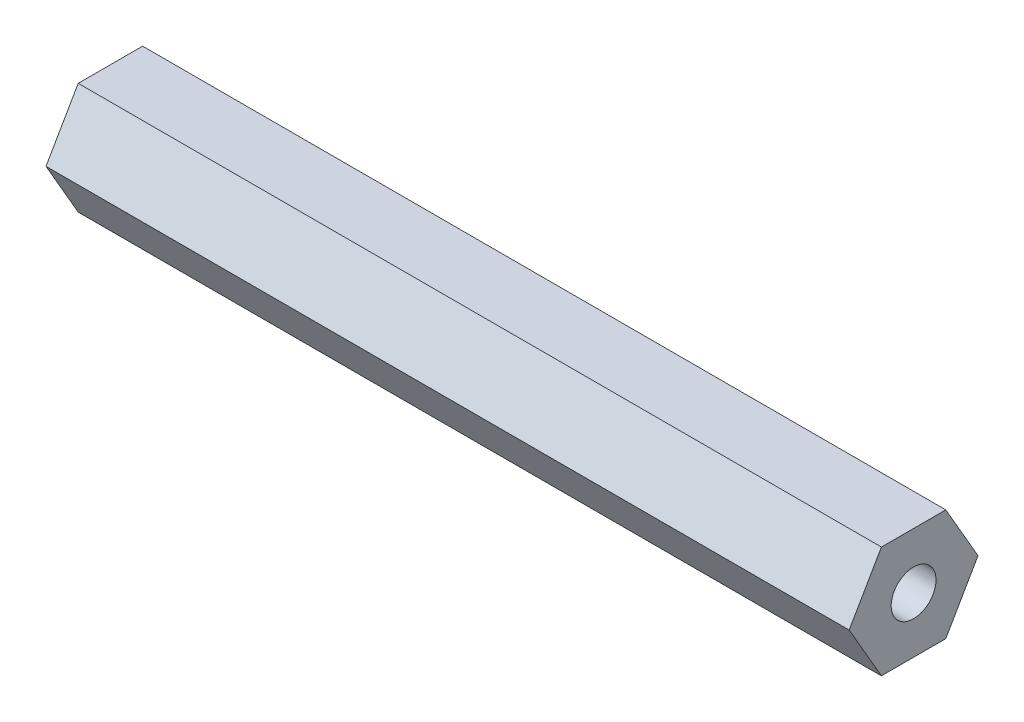
ISO-10303-21;
HEADER;
FILE_DESCRIPTION(('STEP AP214'),'2;1');
FILE_NAME('part.step','',(''),(''),'','','');
FILE_SCHEMA(('AUTOMOTIVE_DESIGN { 1 0 10303 214 1 1 1 1 }'));
ENDSEC;
DATA;
#1=APPLICATION_CONTEXT('core data for automotive mechanical design processes');
#2=APPLICATION_PROTOCOL_DEFINITION('international standard','automotive_design',2000,#1);
#3=PRODUCT_CONTEXT('',#1,'mechanical');
#4=PRODUCT('Part','Part','',(#3));
#5=PRODUCT_RELATED_PRODUCT_CATEGORY('part','',(#4));
#6=PRODUCT_DEFINITION_FORMATION('','',#4);
#7=PRODUCT_DEFINITION_CONTEXT('part definition',#1,'design');
#8=PRODUCT_DEFINITION('design','',#6,#7);
#9=PRODUCT_DEFINITION_SHAPE('','',#8);
#10=(LENGTH_UNIT() NAMED_UNIT(*) SI_UNIT(.MILLI.,.METRE.));
#11=(NAMED_UNIT(*) PLANE_ANGLE_UNIT() SI_UNIT($,.RADIAN.));
#12=(NAMED_UNIT(*) SI_UNIT($,.STERADIAN.) SOLID_ANGLE_UNIT());
#13=UNCERTAINTY_MEASURE_WITH_UNIT(LENGTH_MEASURE(1.E-05),#10,'distance_accuracy_value','');
#14=(GEOMETRIC_REPRESENTATION_CONTEXT(3) GLOBAL_UNCERTAINTY_ASSIGNED_CONTEXT((#13)) GLOBAL_UNIT_ASSIGNED_CONTEXT((#10,
#11,#12)) REPRESENTATION_CONTEXT('',''));
#15=CARTESIAN_POINT('',(0.,0.,0.));
#16=DIRECTION('',(0.,0.,1.));
#17=DIRECTION('',(1.,0.,0.));
#18=AXIS2_PLACEMENT_3D('',#15,#16,#17);
#19=CARTESIAN_POINT('',(91.44,-6.34999999999993,-3.66617420935418));
#20=DIRECTION('',(0.,0.499999999999995,0.866025403784441));
#21=DIRECTION('',(0.,-0.866025403784441,0.499999999999995));
#22=AXIS2_PLACEMENT_3D('',#19,#20,#21);
#23=PLANE('',#22);
#24=DIRECTION('',(0.,0.866025403784441,-0.499999999999995));
#25=VECTOR('',#24,1.);
#26=CARTESIAN_POINT('',(0.,-6.34999999999993,-3.66617420935418));
#27=LINE('',#26,#25);
#28=CARTESIAN_POINT('',(0.,-6.34999999999993,-3.66617420935418));
#29=VERTEX_POINT('',#28);
#30=CARTESIAN_POINT('',(0.,0.,-7.33234841870821));
#31=VERTEX_POINT('',#30);
#32=EDGE_CURVE('E137',#29,#31,#27,.T.);
#33=ORIENTED_EDGE('',*,*,#32,.T.);
#34=DIRECTION('',(-1.,0.,0.));
#35=VECTOR('',#34,1.);
#36=CARTESIAN_POINT('',(91.44,0.,-7.33234841870821));
#37=LINE('',#36,#35);
#38=CARTESIAN_POINT('',(91.44,0.,-7.33234841870821));
#39=VERTEX_POINT('',#38);
#40=EDGE_CURVE('E11',#39,#31,#37,.T.);
#41=ORIENTED_EDGE('',*,*,#40,.F.);
#42=DIRECTION('',(0.,0.866025403784441,-0.499999999999995));
#43=VECTOR('',#42,1.);
#44=CARTESIAN_POINT('',(91.44,-6.34999999999993,-3.66617420935418));
#45=LINE('',#44,#43);
#46=CARTESIAN_POINT('',(91.44,-6.34999999999993,-3.66617420935418));
#47=VERTEX_POINT('',#46);
#48=EDGE_CURVE('E154',#47,#39,#45,.T.);
#49=ORIENTED_EDGE('',*,*,#48,.F.);
#50=DIRECTION('',(-1.,0.,0.));
#51=VECTOR('',#50,1.);
#52=CARTESIAN_POINT('',(91.44,-6.34999999999993,-3.66617420935418));
#53=LINE('',#52,#51);
#54=EDGE_CURVE('E133',#47,#29,#53,.T.);
#55=ORIENTED_EDGE('',*,*,#54,.T.);
#56=EDGE_LOOP('',(#33,#41,#49,#55));
#57=FACE_BOUND('',#56,.T.);
#58=ADVANCED_FACE('F45',(#57),#23,.F.);
#59=CARTESIAN_POINT('',(91.44,0.,-7.33234841870821));
#60=DIRECTION('',(0.,-0.500000000000001,0.866025403784438));
#61=DIRECTION('',(0.,-0.866025403784438,-0.500000000000001));
#62=AXIS2_PLACEMENT_3D('',#59,#60,#61);
#63=PLANE('',#62);
#64=DIRECTION('',(0.,0.866025403784438,0.500000000000001));
#65=VECTOR('',#64,1.);
#66=CARTESIAN_POINT('',(0.,0.,-7.33234841870821));
#67=LINE('',#66,#65);
#68=CARTESIAN_POINT('',(0.,6.34999999999998,-3.66617420935409));
#69=VERTEX_POINT('',#68);
#70=EDGE_CURVE('E141',#31,#69,#67,.T.);
#71=ORIENTED_EDGE('',*,*,#70,.T.);
#72=DIRECTION('',(-1.,0.,0.));
#73=VECTOR('',#72,1.);
#74=CARTESIAN_POINT('',(91.44,6.34999999999998,-3.66617420935409));
#75=LINE('',#74,#73);
#76=CARTESIAN_POINT('',(91.44,6.34999999999998,-3.66617420935409));
#77=VERTEX_POINT('',#76);
#78=EDGE_CURVE('E54',#77,#69,#75,.T.);
#79=ORIENTED_EDGE('',*,*,#78,.F.);
#80=DIRECTION('',(0.,0.866025403784438,0.500000000000001));
#81=VECTOR('',#80,1.);
#82=CARTESIAN_POINT('',(91.44,0.,-7.33234841870821));
#83=LINE('',#82,#81);
#84=EDGE_CURVE('E100',#39,#77,#83,.T.);
#85=ORIENTED_EDGE('',*,*,#84,.F.);
#86=ORIENTED_EDGE('',*,*,#40,.T.);
#87=EDGE_LOOP('',(#71,#79,#85,#86));
#88=FACE_BOUND('',#87,.T.);
#89=ADVANCED_FACE('F183',(#88),#63,.F.);
#90=CARTESIAN_POINT('',(91.44,6.34999999999998,-3.66617420935409));
#91=DIRECTION('',(0.,-1.,0.));
#92=DIRECTION('',(0.,0.,-1.));
#93=AXIS2_PLACEMENT_3D('',#90,#91,#92);
#94=PLANE('',#93);
#95=DIRECTION('',(0.,0.,1.));
#96=VECTOR('',#95,1.);
#97=CARTESIAN_POINT('',(0.,6.34999999999998,-3.66617420935409));
#98=LINE('',#97,#96);
#99=CARTESIAN_POINT('',(0.,6.34999999999995,3.66617420935413));
#100=VERTEX_POINT('',#99);
#101=EDGE_CURVE('E145',#69,#100,#98,.T.);
#102=ORIENTED_EDGE('',*,*,#101,.T.);
#103=DIRECTION('',(-1.,0.,0.));
#104=VECTOR('',#103,1.);
#105=CARTESIAN_POINT('',(91.44,6.34999999999995,3.66617420935413));
#106=LINE('',#105,#104);
#107=CARTESIAN_POINT('',(91.44,6.34999999999995,3.66617420935413));
#108=VERTEX_POINT('',#107);
#109=EDGE_CURVE('E126',#108,#100,#106,.T.);
#110=ORIENTED_EDGE('',*,*,#109,.F.);
#111=DIRECTION('',(0.,0.,1.));
#112=VECTOR('',#111,1.);
#113=CARTESIAN_POINT('',(91.44,6.34999999999998,-3.66617420935409));
#114=LINE('',#113,#112);
#115=EDGE_CURVE('E115',#77,#108,#114,.T.);
#116=ORIENTED_EDGE('',*,*,#115,.F.);
#117=ORIENTED_EDGE('',*,*,#78,.T.);
#118=EDGE_LOOP('',(#102,#110,#116,#117));
#119=FACE_BOUND('',#118,.T.);
#120=ADVANCED_FACE('F164',(#119),#94,.F.);
#121=CARTESIAN_POINT('',(91.44,6.34999999999995,3.66617420935413));
#122=DIRECTION('',(0.,-0.499999999999995,-0.866025403784442));
#123=DIRECTION('',(0.,0.866025403784442,-0.499999999999995));
#124=AXIS2_PLACEMENT_3D('',#121,#122,#123);
#125=PLANE('',#124);
#126=DIRECTION('',(0.,-0.866025403784442,0.499999999999995));
#127=VECTOR('',#126,1.);
#128=CARTESIAN_POINT('',(0.,6.34999999999995,3.66617420935413));
#129=LINE('',#128,#127);
#130=CARTESIAN_POINT('',(0.,0.,7.33234841870821));
#131=VERTEX_POINT('',#130);
#132=EDGE_CURVE('E124',#100,#131,#129,.T.);
#133=ORIENTED_EDGE('',*,*,#132,.T.);
#134=DIRECTION('',(-1.,0.,0.));
#135=VECTOR('',#134,1.);
#136=CARTESIAN_POINT('',(91.44,0.,7.33234841870821));
#137=LINE('',#136,#135);
#138=CARTESIAN_POINT('',(91.44,0.,7.33234841870821));
#139=VERTEX_POINT('',#138);
#140=EDGE_CURVE('E121',#139,#131,#137,.T.);
#141=ORIENTED_EDGE('',*,*,#140,.F.);
#142=DIRECTION('',(0.,-0.866025403784442,0.499999999999995));
#143=VECTOR('',#142,1.);
#144=CARTESIAN_POINT('',(91.44,6.34999999999995,3.66617420935413));
#145=LINE('',#144,#143);
#146=EDGE_CURVE('E109',#108,#139,#145,.T.);
#147=ORIENTED_EDGE('',*,*,#146,.F.);
#148=ORIENTED_EDGE('',*,*,#109,.T.);
#149=EDGE_LOOP('',(#133,#141,#147,#148));
#150=FACE_BOUND('',#149,.T.);
#151=ADVANCED_FACE('F122',(#150),#125,.F.);
#152=CARTESIAN_POINT('',(91.44,0.,7.33234841870821));
#153=DIRECTION('',(0.,0.500000000000007,-0.866025403784434));
#154=DIRECTION('',(0.,0.866025403784435,0.500000000000007));
#155=AXIS2_PLACEMENT_3D('',#152,#153,#154);
#156=PLANE('',#155);
#157=DIRECTION('',(0.,-0.866025403784435,-0.500000000000007));
#158=VECTOR('',#157,1.);
#159=CARTESIAN_POINT('',(0.,0.,7.33234841870821));
#160=LINE('',#159,#158);
#161=CARTESIAN_POINT('',(0.,-6.35,3.66617420935405));
#162=VERTEX_POINT('',#161);
#163=EDGE_CURVE('E86',#131,#162,#160,.T.);
#164=ORIENTED_EDGE('',*,*,#163,.T.);
#165=DIRECTION('',(-1.,0.,0.));
#166=VECTOR('',#165,1.);
#167=CARTESIAN_POINT('',(91.44,-6.35,3.66617420935405));
#168=LINE('',#167,#166);
#169=CARTESIAN_POINT('',(91.44,-6.35,3.66617420935405));
#170=VERTEX_POINT('',#169);
#171=EDGE_CURVE('E127',#170,#162,#168,.T.);
#172=ORIENTED_EDGE('',*,*,#171,.F.);
#173=DIRECTION('',(0.,-0.866025403784435,-0.500000000000007));
#174=VECTOR('',#173,1.);
#175=CARTESIAN_POINT('',(91.44,0.,7.33234841870821));
#176=LINE('',#175,#174);
#177=EDGE_CURVE('E113',#139,#170,#176,.T.);
#178=ORIENTED_EDGE('',*,*,#177,.F.);
#179=ORIENTED_EDGE('',*,*,#140,.T.);
#180=EDGE_LOOP('',(#164,#172,#178,#179));
#181=FACE_BOUND('',#180,.T.);
#182=ADVANCED_FACE('F129',(#181),#156,.F.);
#183=CARTESIAN_POINT('',(91.44,-6.35,3.66617420935405));
#184=DIRECTION('',(0.,1.,0.));
#185=DIRECTION('',(0.,0.,1.));
#186=AXIS2_PLACEMENT_3D('',#183,#184,#185);
#187=PLANE('',#186);
#188=DIRECTION('',(0.,0.,-1.));
#189=VECTOR('',#188,1.);
#190=CARTESIAN_POINT('',(0.,-6.35,3.66617420935405));
#191=LINE('',#190,#189);
#192=EDGE_CURVE('E92',#162,#29,#191,.T.);
#193=ORIENTED_EDGE('',*,*,#192,.T.);
#194=ORIENTED_EDGE('',*,*,#54,.F.);
#195=DIRECTION('',(0.,0.,-1.));
#196=VECTOR('',#195,1.);
#197=CARTESIAN_POINT('',(91.44,-6.35,3.66617420935405));
#198=LINE('',#197,#196);
#199=EDGE_CURVE('E62',#170,#47,#198,.T.);
#200=ORIENTED_EDGE('',*,*,#199,.F.);
#201=ORIENTED_EDGE('',*,*,#171,.T.);
#202=EDGE_LOOP('',(#193,#194,#200,#201));
#203=FACE_BOUND('',#202,.T.);
#204=ADVANCED_FACE('F171',(#203),#187,.F.);
#205=CARTESIAN_POINT('',(91.44,0.,0.));
#206=DIRECTION('',(1.,0.,0.));
#207=DIRECTION('',(0.,0.,-1.));
#208=AXIS2_PLACEMENT_3D('',#205,#206,#207);
#209=PLANE('',#208);
#210=CARTESIAN_POINT('',(91.44,0.,0.));
#211=DIRECTION('',(1.,0.,0.));
#212=DIRECTION('',(0.,0.,-1.));
#213=AXIS2_PLACEMENT_3D('',#210,#211,#212);
#214=CIRCLE('',#213,2.5527);
#215=CARTESIAN_POINT('',(91.44,0.,-2.5527));
#216=VERTEX_POINT('',#215);
#217=EDGE_CURVE('E307',#216,#216,#214,.T.);
#218=ORIENTED_EDGE('',*,*,#217,.F.);
#219=EDGE_LOOP('',(#218));
#220=FACE_BOUND('',#219,.T.);
#221=ORIENTED_EDGE('',*,*,#48,.T.);
#222=ORIENTED_EDGE('',*,*,#84,.T.);
#223=ORIENTED_EDGE('',*,*,#115,.T.);
#224=ORIENTED_EDGE('',*,*,#146,.T.);
#225=ORIENTED_EDGE('',*,*,#177,.T.);
#226=ORIENTED_EDGE('',*,*,#199,.T.);
#227=EDGE_LOOP('',(#221,#222,#223,#224,#225,#226));
#228=FACE_BOUND('',#227,.T.);
#229=ADVANCED_FACE('F111',(#220,#228),#209,.T.);
#230=CARTESIAN_POINT('',(0.,0.,0.));
#231=DIRECTION('',(1.,0.,0.));
#232=DIRECTION('',(0.,0.,-1.));
#233=AXIS2_PLACEMENT_3D('',#230,#231,#232);
#234=PLANE('',#233);
#235=CARTESIAN_POINT('',(0.,0.,0.));
#236=DIRECTION('',(-1.,0.,0.));
#237=DIRECTION('',(0.,0.,1.));
#238=AXIS2_PLACEMENT_3D('',#235,#236,#237);
#239=CIRCLE('',#238,2.5527);
#240=CARTESIAN_POINT('',(0.,0.,2.5527));
#241=VERTEX_POINT('',#240);
#242=EDGE_CURVE('E311',#241,#241,#239,.T.);
#243=ORIENTED_EDGE('',*,*,#242,.F.);
#244=EDGE_LOOP('',(#243));
#245=FACE_BOUND('',#244,.T.);
#246=ORIENTED_EDGE('',*,*,#32,.F.);
#247=ORIENTED_EDGE('',*,*,#192,.F.);
#248=ORIENTED_EDGE('',*,*,#163,.F.);
#249=ORIENTED_EDGE('',*,*,#132,.F.);
#250=ORIENTED_EDGE('',*,*,#101,.F.);
#251=ORIENTED_EDGE('',*,*,#70,.F.);
#252=EDGE_LOOP('',(#246,#247,#248,#249,#250,#251));
#253=FACE_BOUND('',#252,.T.);
#254=ADVANCED_FACE('F167',(#245,#253),#234,.F.);
#255=CARTESIAN_POINT('',(12.7,0.,0.));
#256=DIRECTION('',(-1.,0.,0.));
#257=DIRECTION('',(0.,0.,1.));
#258=AXIS2_PLACEMENT_3D('',#255,#256,#257);
#259=CONICAL_SURFACE('',#258,2.5527,1.02974425867665);
#260=CARTESIAN_POINT('',(14.2338169021917,0.,0.));
#261=VERTEX_POINT('',#260);
#262=VERTEX_LOOP('',#261);
#263=FACE_BOUND('',#262,.T.);
#264=CARTESIAN_POINT('',(12.7,0.,0.));
#265=DIRECTION('',(-1.,0.,0.));
#266=DIRECTION('',(0.,0.,1.));
#267=AXIS2_PLACEMENT_3D('',#264,#265,#266);
#268=CIRCLE('',#267,2.5527);
#269=CARTESIAN_POINT('',(12.7,0.,2.5527));
#270=VERTEX_POINT('',#269);
#271=EDGE_CURVE('E142',#270,#270,#268,.T.);
#272=ORIENTED_EDGE('',*,*,#271,.T.);
#273=EDGE_LOOP('',(#272));
#274=FACE_BOUND('',#273,.T.);
#275=ADVANCED_FACE('F217',(#263,#274),#259,.F.);
#276=CARTESIAN_POINT('',(0.,0.,0.));
#277=DIRECTION('',(-1.,0.,0.));
#278=DIRECTION('',(0.,0.,1.));
#279=AXIS2_PLACEMENT_3D('',#276,#277,#278);
#280=CYLINDRICAL_SURFACE('',#279,2.5527);
#281=ORIENTED_EDGE('',*,*,#271,.F.);
#282=EDGE_LOOP('',(#281));
#283=FACE_BOUND('',#282,.T.);
#284=ORIENTED_EDGE('',*,*,#242,.T.);
#285=EDGE_LOOP('',(#284));
#286=FACE_BOUND('',#285,.T.);
#287=ADVANCED_FACE('F227',(#283,#286),#280,.F.);
#288=CARTESIAN_POINT('',(78.74,0.,0.));
#289=DIRECTION('',(1.,0.,0.));
#290=DIRECTION('',(0.,0.,-1.));
#291=AXIS2_PLACEMENT_3D('',#288,#289,#290);
#292=CONICAL_SURFACE('',#291,2.5527,1.02974425867665);
#293=CARTESIAN_POINT('',(77.2061830978083,0.,0.));
#294=VERTEX_POINT('',#293);
#295=VERTEX_LOOP('',#294);
#296=FACE_BOUND('',#295,.T.);
#297=CARTESIAN_POINT('',(78.74,0.,0.));
#298=DIRECTION('',(1.,0.,0.));
#299=DIRECTION('',(0.,0.,-1.));
#300=AXIS2_PLACEMENT_3D('',#297,#298,#299);
#301=CIRCLE('',#300,2.5527);
#302=CARTESIAN_POINT('',(78.74,0.,-2.5527));
#303=VERTEX_POINT('',#302);
#304=EDGE_CURVE('E304',#303,#303,#301,.T.);
#305=ORIENTED_EDGE('',*,*,#304,.T.);
#306=EDGE_LOOP('',(#305));
#307=FACE_BOUND('',#306,.T.);
#308=ADVANCED_FACE('F238',(#296,#307),#292,.F.);
#309=CARTESIAN_POINT('',(91.44,0.,0.));
#310=DIRECTION('',(1.,0.,0.));
#311=DIRECTION('',(0.,0.,-1.));
#312=AXIS2_PLACEMENT_3D('',#309,#310,#311);
#313=CYLINDRICAL_SURFACE('',#312,2.5527);
#314=ORIENTED_EDGE('',*,*,#304,.F.);
#315=EDGE_LOOP('',(#314));
#316=FACE_BOUND('',#315,.T.);
#317=ORIENTED_EDGE('',*,*,#217,.T.);
#318=EDGE_LOOP('',(#317));
#319=FACE_BOUND('',#318,.T.);
#320=ADVANCED_FACE('F255',(#316,#319),#313,.F.);
#321=CLOSED_SHELL('',(#58,#89,#120,#151,#182,#204,#229,#254,#275,#287,#308,#320));
#322=MANIFOLD_SOLID_BREP('B2',#321);
#323=ADVANCED_BREP_SHAPE_REPRESENTATION('',(#18,#322),#14);
#324=SHAPE_DEFINITION_REPRESENTATION(#9,#323);
ENDSEC;
END-ISO-10303-21;
